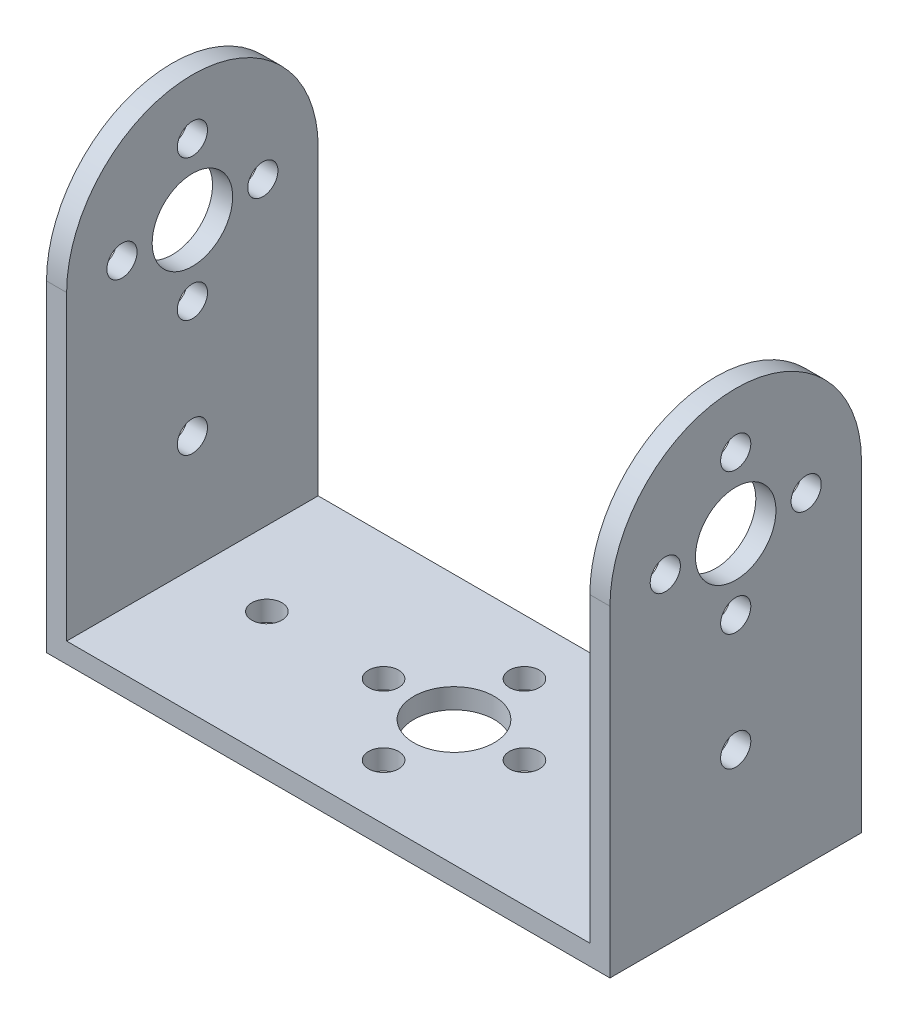
ISO-10303-21;
HEADER;
FILE_DESCRIPTION(('STEP AP214'),'2;1');
FILE_NAME('part.step','',(''),(''),'','','');
FILE_SCHEMA(('AUTOMOTIVE_DESIGN { 1 0 10303 214 1 1 1 1 }'));
ENDSEC;
DATA;
#1=APPLICATION_CONTEXT('core data for automotive mechanical design processes');
#2=APPLICATION_PROTOCOL_DEFINITION('international standard','automotive_design',2000,#1);
#3=PRODUCT_CONTEXT('',#1,'mechanical');
#4=PRODUCT('Part','Part','',(#3));
#5=PRODUCT_RELATED_PRODUCT_CATEGORY('part','',(#4));
#6=PRODUCT_DEFINITION_FORMATION('','',#4);
#7=PRODUCT_DEFINITION_CONTEXT('part definition',#1,'design');
#8=PRODUCT_DEFINITION('design','',#6,#7);
#9=PRODUCT_DEFINITION_SHAPE('','',#8);
#10=(LENGTH_UNIT() NAMED_UNIT(*) SI_UNIT(.MILLI.,.METRE.));
#11=(NAMED_UNIT(*) PLANE_ANGLE_UNIT() SI_UNIT($,.RADIAN.));
#12=(NAMED_UNIT(*) SI_UNIT($,.STERADIAN.) SOLID_ANGLE_UNIT());
#13=UNCERTAINTY_MEASURE_WITH_UNIT(LENGTH_MEASURE(1.E-05),#10,'distance_accuracy_value','');
#14=(GEOMETRIC_REPRESENTATION_CONTEXT(3) GLOBAL_UNCERTAINTY_ASSIGNED_CONTEXT((#13)) GLOBAL_UNIT_ASSIGNED_CONTEXT((#10,
#11,#12)) REPRESENTATION_CONTEXT('',''));
#15=CARTESIAN_POINT('',(0.,0.,0.));
#16=DIRECTION('',(0.,0.,1.));
#17=DIRECTION('',(1.,0.,0.));
#18=AXIS2_PLACEMENT_3D('',#15,#16,#17);
#19=CARTESIAN_POINT('',(0.,2.,0.));
#20=DIRECTION('',(0.,1.,0.));
#21=DIRECTION('',(0.,0.,1.));
#22=AXIS2_PLACEMENT_3D('',#19,#20,#21);
#23=PLANE('',#22);
#24=CARTESIAN_POINT('',(26.2542553191489,2.,-0.73138297872341));
#25=DIRECTION('',(0.,1.,0.));
#26=DIRECTION('',(0.,0.,1.));
#27=AXIS2_PLACEMENT_3D('',#24,#25,#26);
#28=CIRCLE('',#27,1.5);
#29=CARTESIAN_POINT('',(26.2542553191489,2.,0.768617021276591));
#30=VERTEX_POINT('',#29);
#31=EDGE_CURVE('E190',#30,#30,#28,.T.);
#32=ORIENTED_EDGE('',*,*,#31,.F.);
#33=EDGE_LOOP('',(#32));
#34=FACE_BOUND('',#33,.T.);
#35=CARTESIAN_POINT('',(0.654255319149036,2.,-0.731382978723379));
#36=DIRECTION('',(0.,1.,0.));
#37=DIRECTION('',(0.,0.,1.));
#38=AXIS2_PLACEMENT_3D('',#35,#36,#37);
#39=CIRCLE('',#38,1.5);
#40=CARTESIAN_POINT('',(0.654255319149036,2.,0.768617021276619));
#41=VERTEX_POINT('',#40);
#42=EDGE_CURVE('E203',#41,#41,#39,.T.);
#43=ORIENTED_EDGE('',*,*,#42,.F.);
#44=EDGE_LOOP('',(#43));
#45=FACE_BOUND('',#44,.T.);
#46=CARTESIAN_POINT('',(7.65425531914909,2.,6.2686170212766));
#47=DIRECTION('',(0.,1.,0.));
#48=DIRECTION('',(0.,0.,1.));
#49=AXIS2_PLACEMENT_3D('',#46,#47,#48);
#50=CIRCLE('',#49,1.5);
#51=CARTESIAN_POINT('',(7.65425531914909,2.,7.7686170212766));
#52=VERTEX_POINT('',#51);
#53=EDGE_CURVE('E197',#52,#52,#50,.T.);
#54=ORIENTED_EDGE('',*,*,#53,.F.);
#55=EDGE_LOOP('',(#54));
#56=FACE_BOUND('',#55,.T.);
#57=CARTESIAN_POINT('',(14.654255319149,2.,-0.731382978723479));
#58=DIRECTION('',(0.,1.,0.));
#59=DIRECTION('',(0.,0.,1.));
#60=AXIS2_PLACEMENT_3D('',#57,#58,#59);
#61=CIRCLE('',#60,1.5);
#62=CARTESIAN_POINT('',(14.654255319149,2.,0.768617021276519));
#63=VERTEX_POINT('',#62);
#64=EDGE_CURVE('E196',#63,#63,#61,.T.);
#65=ORIENTED_EDGE('',*,*,#64,.F.);
#66=EDGE_LOOP('',(#65));
#67=FACE_BOUND('',#66,.T.);
#68=CARTESIAN_POINT('',(-10.9457446808511,2.,-0.731382978723405));
#69=DIRECTION('',(0.,1.,0.));
#70=DIRECTION('',(0.,0.,1.));
#71=AXIS2_PLACEMENT_3D('',#68,#69,#70);
#72=CIRCLE('',#71,1.5);
#73=CARTESIAN_POINT('',(-10.9457446808511,2.,0.768617021276595));
#74=VERTEX_POINT('',#73);
#75=EDGE_CURVE('E221',#74,#74,#72,.T.);
#76=ORIENTED_EDGE('',*,*,#75,.F.);
#77=EDGE_LOOP('',(#76));
#78=FACE_BOUND('',#77,.T.);
#79=CARTESIAN_POINT('',(7.65425531914894,2.,-7.73138297872341));
#80=DIRECTION('',(0.,1.,0.));
#81=DIRECTION('',(0.,0.,1.));
#82=AXIS2_PLACEMENT_3D('',#79,#80,#81);
#83=CIRCLE('',#82,1.5);
#84=CARTESIAN_POINT('',(7.65425531914894,2.,-6.23138297872341));
#85=VERTEX_POINT('',#84);
#86=EDGE_CURVE('E215',#85,#85,#83,.T.);
#87=ORIENTED_EDGE('',*,*,#86,.F.);
#88=EDGE_LOOP('',(#87));
#89=FACE_BOUND('',#88,.T.);
#90=CARTESIAN_POINT('',(7.65425531914894,2.,-0.731382978723405));
#91=DIRECTION('',(0.,1.,0.));
#92=DIRECTION('',(0.,0.,1.));
#93=AXIS2_PLACEMENT_3D('',#90,#91,#92);
#94=CIRCLE('',#93,4.);
#95=CARTESIAN_POINT('',(7.65425531914894,2.,3.2686170212766));
#96=VERTEX_POINT('',#95);
#97=EDGE_CURVE('E214',#96,#96,#94,.T.);
#98=ORIENTED_EDGE('',*,*,#97,.F.);
#99=EDGE_LOOP('',(#98));
#100=FACE_BOUND('',#99,.T.);
#101=DIRECTION('',(1.,0.,0.));
#102=VECTOR('',#101,1.);
#103=CARTESIAN_POINT('',(-20.3457446808511,2.,11.7686170212766));
#104=LINE('',#103,#102);
#105=CARTESIAN_POINT('',(-18.3457446808511,2.,11.7686170212766));
#106=VERTEX_POINT('',#105);
#107=CARTESIAN_POINT('',(33.6542553191489,2.,11.7686170212766));
#108=VERTEX_POINT('',#107);
#109=EDGE_CURVE('E51',#106,#108,#104,.T.);
#110=ORIENTED_EDGE('',*,*,#109,.T.);
#111=DIRECTION('',(0.,0.,1.));
#112=VECTOR('',#111,1.);
#113=CARTESIAN_POINT('',(33.6542553191489,2.,-13.2313829787234));
#114=LINE('',#113,#112);
#115=CARTESIAN_POINT('',(33.6542553191489,2.,-13.2313829787234));
#116=VERTEX_POINT('',#115);
#117=EDGE_CURVE('E124',#116,#108,#114,.T.);
#118=ORIENTED_EDGE('',*,*,#117,.F.);
#119=DIRECTION('',(-1.,0.,0.));
#120=VECTOR('',#119,1.);
#121=CARTESIAN_POINT('',(-20.3457446808511,2.,-13.2313829787234));
#122=LINE('',#121,#120);
#123=CARTESIAN_POINT('',(-18.3457446808511,2.,-13.2313829787234));
#124=VERTEX_POINT('',#123);
#125=EDGE_CURVE('E128',#116,#124,#122,.T.);
#126=ORIENTED_EDGE('',*,*,#125,.T.);
#127=DIRECTION('',(0.,0.,1.));
#128=VECTOR('',#127,1.);
#129=CARTESIAN_POINT('',(-18.3457446808511,2.,-13.2313829787234));
#130=LINE('',#129,#128);
#131=EDGE_CURVE('E178',#124,#106,#130,.T.);
#132=ORIENTED_EDGE('',*,*,#131,.T.);
#133=EDGE_LOOP('',(#110,#118,#126,#132));
#134=FACE_BOUND('',#133,.T.);
#135=ADVANCED_FACE('F36',(#34,#45,#56,#67,#78,#89,#100,#134),#23,.T.);
#136=CARTESIAN_POINT('',(-20.3457446808511,2.,-13.2313829787234));
#137=DIRECTION('',(1.,0.,0.));
#138=DIRECTION('',(0.,0.,-1.));
#139=AXIS2_PLACEMENT_3D('',#136,#137,#138);
#140=PLANE('',#139);
#141=CARTESIAN_POINT('',(-20.3457446808511,32.,-7.73138297872331));
#142=DIRECTION('',(-1.,0.,0.));
#143=DIRECTION('',(0.,0.,1.));
#144=AXIS2_PLACEMENT_3D('',#141,#142,#143);
#145=CIRCLE('',#144,1.5);
#146=CARTESIAN_POINT('',(-20.3457446808511,32.,-6.23138297872331));
#147=VERTEX_POINT('',#146);
#148=EDGE_CURVE('E138',#147,#147,#145,.T.);
#149=ORIENTED_EDGE('',*,*,#148,.F.);
#150=EDGE_LOOP('',(#149));
#151=FACE_BOUND('',#150,.T.);
#152=CARTESIAN_POINT('',(-20.3457446808511,25.,-0.731382978723258));
#153=DIRECTION('',(-1.,0.,0.));
#154=DIRECTION('',(0.,0.,1.));
#155=AXIS2_PLACEMENT_3D('',#152,#153,#154);
#156=CIRCLE('',#155,1.5);
#157=CARTESIAN_POINT('',(-20.3457446808511,25.,0.768617021276742));
#158=VERTEX_POINT('',#157);
#159=EDGE_CURVE('E148',#158,#158,#156,.T.);
#160=ORIENTED_EDGE('',*,*,#159,.F.);
#161=EDGE_LOOP('',(#160));
#162=FACE_BOUND('',#161,.T.);
#163=CARTESIAN_POINT('',(-20.3457446808511,32.0000000000001,6.26861702127669));
#164=DIRECTION('',(-1.,0.,0.));
#165=DIRECTION('',(0.,0.,1.));
#166=AXIS2_PLACEMENT_3D('',#163,#164,#165);
#167=CIRCLE('',#166,1.5);
#168=CARTESIAN_POINT('',(-20.3457446808511,32.0000000000001,7.76861702127669));
#169=VERTEX_POINT('',#168);
#170=EDGE_CURVE('E140',#169,#169,#167,.T.);
#171=ORIENTED_EDGE('',*,*,#170,.F.);
#172=EDGE_LOOP('',(#171));
#173=FACE_BOUND('',#172,.T.);
#174=CARTESIAN_POINT('',(-20.3457446808511,39.,-0.731382978723405));
#175=DIRECTION('',(-1.,0.,0.));
#176=DIRECTION('',(0.,0.,1.));
#177=AXIS2_PLACEMENT_3D('',#174,#175,#176);
#178=CIRCLE('',#177,1.5);
#179=CARTESIAN_POINT('',(-20.3457446808511,39.,0.768617021276596));
#180=VERTEX_POINT('',#179);
#181=EDGE_CURVE('E147',#180,#180,#178,.T.);
#182=ORIENTED_EDGE('',*,*,#181,.F.);
#183=EDGE_LOOP('',(#182));
#184=FACE_BOUND('',#183,.T.);
#185=CARTESIAN_POINT('',(-20.3457446808511,32.,-0.731382978723405));
#186=DIRECTION('',(-1.,0.,0.));
#187=DIRECTION('',(0.,0.,1.));
#188=AXIS2_PLACEMENT_3D('',#185,#186,#187);
#189=CIRCLE('',#188,4.);
#190=CARTESIAN_POINT('',(-20.3457446808511,32.,3.2686170212766));
#191=VERTEX_POINT('',#190);
#192=EDGE_CURVE('E158',#191,#191,#189,.T.);
#193=ORIENTED_EDGE('',*,*,#192,.F.);
#194=EDGE_LOOP('',(#193));
#195=FACE_BOUND('',#194,.T.);
#196=CARTESIAN_POINT('',(-20.3457446808511,13.4,-0.731382978723405));
#197=DIRECTION('',(-1.,0.,0.));
#198=DIRECTION('',(0.,0.,1.));
#199=AXIS2_PLACEMENT_3D('',#196,#197,#198);
#200=CIRCLE('',#199,1.5);
#201=CARTESIAN_POINT('',(-20.3457446808511,13.4,0.768617021276595));
#202=VERTEX_POINT('',#201);
#203=EDGE_CURVE('E165',#202,#202,#200,.T.);
#204=ORIENTED_EDGE('',*,*,#203,.F.);
#205=EDGE_LOOP('',(#204));
#206=FACE_BOUND('',#205,.T.);
#207=DIRECTION('',(0.,0.,1.));
#208=VECTOR('',#207,1.);
#209=CARTESIAN_POINT('',(-20.3457446808511,0.,-13.2313829787234));
#210=LINE('',#209,#208);
#211=CARTESIAN_POINT('',(-20.3457446808511,0.,-13.2313829787234));
#212=VERTEX_POINT('',#211);
#213=CARTESIAN_POINT('',(-20.3457446808511,0.,11.7686170212766));
#214=VERTEX_POINT('',#213);
#215=EDGE_CURVE('E232',#212,#214,#210,.T.);
#216=ORIENTED_EDGE('',*,*,#215,.T.);
#217=DIRECTION('',(0.,-1.,0.));
#218=VECTOR('',#217,1.);
#219=CARTESIAN_POINT('',(-20.3457446808511,2.,11.7686170212766));
#220=LINE('',#219,#218);
#221=CARTESIAN_POINT('',(-20.3457446808511,32.,11.7686170212766));
#222=VERTEX_POINT('',#221);
#223=EDGE_CURVE('E11',#222,#214,#220,.T.);
#224=ORIENTED_EDGE('',*,*,#223,.F.);
#225=CARTESIAN_POINT('',(-20.3457446808511,32.,-0.731382978723405));
#226=DIRECTION('',(-1.,0.,0.));
#227=DIRECTION('',(0.,0.,1.));
#228=AXIS2_PLACEMENT_3D('',#225,#226,#227);
#229=CIRCLE('',#228,12.5);
#230=CARTESIAN_POINT('',(-20.3457446808511,32.,-13.2313829787234));
#231=VERTEX_POINT('',#230);
#232=EDGE_CURVE('E175',#222,#231,#229,.T.);
#233=ORIENTED_EDGE('',*,*,#232,.T.);
#234=DIRECTION('',(0.,-1.,0.));
#235=VECTOR('',#234,1.);
#236=CARTESIAN_POINT('',(-20.3457446808511,2.,-13.2313829787234));
#237=LINE('',#236,#235);
#238=EDGE_CURVE('E238',#231,#212,#237,.T.);
#239=ORIENTED_EDGE('',*,*,#238,.T.);
#240=EDGE_LOOP('',(#216,#224,#233,#239));
#241=FACE_BOUND('',#240,.T.);
#242=ADVANCED_FACE('F38',(#151,#162,#173,#184,#195,#206,#241),#140,.F.);
#243=CARTESIAN_POINT('',(-20.3457446808511,2.,11.7686170212766));
#244=DIRECTION('',(0.,0.,-1.));
#245=DIRECTION('',(-1.,0.,0.));
#246=AXIS2_PLACEMENT_3D('',#243,#244,#245);
#247=PLANE('',#246);
#248=DIRECTION('',(1.,0.,0.));
#249=VECTOR('',#248,1.);
#250=CARTESIAN_POINT('',(-20.3457446808511,0.,11.7686170212766));
#251=LINE('',#250,#249);
#252=CARTESIAN_POINT('',(35.6542553191489,0.,11.7686170212766));
#253=VERTEX_POINT('',#252);
#254=EDGE_CURVE('E241',#214,#253,#251,.T.);
#255=ORIENTED_EDGE('',*,*,#254,.T.);
#256=DIRECTION('',(0.,-1.,0.));
#257=VECTOR('',#256,1.);
#258=CARTESIAN_POINT('',(35.6542553191489,2.,11.7686170212766));
#259=LINE('',#258,#257);
#260=CARTESIAN_POINT('',(35.6542553191489,32.,11.7686170212766));
#261=VERTEX_POINT('',#260);
#262=EDGE_CURVE('E44',#261,#253,#259,.T.);
#263=ORIENTED_EDGE('',*,*,#262,.F.);
#264=DIRECTION('',(1.,0.,0.));
#265=VECTOR('',#264,1.);
#266=CARTESIAN_POINT('',(33.6542553191489,32.,11.7686170212766));
#267=LINE('',#266,#265);
#268=CARTESIAN_POINT('',(33.6542553191489,32.,11.7686170212766));
#269=VERTEX_POINT('',#268);
#270=EDGE_CURVE('E123',#269,#261,#267,.T.);
#271=ORIENTED_EDGE('',*,*,#270,.F.);
#272=DIRECTION('',(0.,1.,0.));
#273=VECTOR('',#272,1.);
#274=CARTESIAN_POINT('',(33.6542553191489,2.,11.7686170212766));
#275=LINE('',#274,#273);
#276=EDGE_CURVE('E110',#108,#269,#275,.T.);
#277=ORIENTED_EDGE('',*,*,#276,.F.);
#278=ORIENTED_EDGE('',*,*,#109,.F.);
#279=DIRECTION('',(0.,1.,0.));
#280=VECTOR('',#279,1.);
#281=CARTESIAN_POINT('',(-18.3457446808511,2.,11.7686170212766));
#282=LINE('',#281,#280);
#283=CARTESIAN_POINT('',(-18.3457446808511,32.,11.7686170212766));
#284=VERTEX_POINT('',#283);
#285=EDGE_CURVE('E59',#106,#284,#282,.T.);
#286=ORIENTED_EDGE('',*,*,#285,.T.);
#287=DIRECTION('',(-1.,0.,0.));
#288=VECTOR('',#287,1.);
#289=CARTESIAN_POINT('',(-18.3457446808511,32.,11.7686170212766));
#290=LINE('',#289,#288);
#291=EDGE_CURVE('E184',#284,#222,#290,.T.);
#292=ORIENTED_EDGE('',*,*,#291,.T.);
#293=ORIENTED_EDGE('',*,*,#223,.T.);
#294=EDGE_LOOP('',(#255,#263,#271,#277,#278,#286,#292,#293));
#295=FACE_BOUND('',#294,.T.);
#296=ADVANCED_FACE('F264',(#295),#247,.F.);
#297=CARTESIAN_POINT('',(35.6542553191489,2.,-13.2313829787234));
#298=DIRECTION('',(-1.,0.,0.));
#299=DIRECTION('',(0.,0.,1.));
#300=AXIS2_PLACEMENT_3D('',#297,#298,#299);
#301=PLANE('',#300);
#302=CARTESIAN_POINT('',(35.6542553191489,32.,-7.73138297872331));
#303=DIRECTION('',(-1.,0.,0.));
#304=DIRECTION('',(0.,0.,1.));
#305=AXIS2_PLACEMENT_3D('',#302,#303,#304);
#306=CIRCLE('',#305,1.5);
#307=CARTESIAN_POINT('',(35.6542553191489,32.,-6.23138297872331));
#308=VERTEX_POINT('',#307);
#309=EDGE_CURVE('E562',#308,#308,#306,.T.);
#310=ORIENTED_EDGE('',*,*,#309,.T.);
#311=EDGE_LOOP('',(#310));
#312=FACE_BOUND('',#311,.T.);
#313=CARTESIAN_POINT('',(35.6542553191489,25.,-0.731382978723258));
#314=DIRECTION('',(-1.,0.,0.));
#315=DIRECTION('',(0.,0.,1.));
#316=AXIS2_PLACEMENT_3D('',#313,#314,#315);
#317=CIRCLE('',#316,1.5);
#318=CARTESIAN_POINT('',(35.6542553191489,25.,0.768617021276742));
#319=VERTEX_POINT('',#318);
#320=EDGE_CURVE('E598',#319,#319,#317,.T.);
#321=ORIENTED_EDGE('',*,*,#320,.T.);
#322=EDGE_LOOP('',(#321));
#323=FACE_BOUND('',#322,.T.);
#324=CARTESIAN_POINT('',(35.6542553191489,32.0000000000001,6.26861702127669));
#325=DIRECTION('',(-1.,0.,0.));
#326=DIRECTION('',(0.,0.,1.));
#327=AXIS2_PLACEMENT_3D('',#324,#325,#326);
#328=CIRCLE('',#327,1.5);
#329=CARTESIAN_POINT('',(35.6542553191489,32.0000000000001,7.76861702127669));
#330=VERTEX_POINT('',#329);
#331=EDGE_CURVE('E582',#330,#330,#328,.T.);
#332=ORIENTED_EDGE('',*,*,#331,.T.);
#333=EDGE_LOOP('',(#332));
#334=FACE_BOUND('',#333,.T.);
#335=CARTESIAN_POINT('',(35.6542553191489,39.,-0.731382978723405));
#336=DIRECTION('',(-1.,0.,0.));
#337=DIRECTION('',(0.,0.,1.));
#338=AXIS2_PLACEMENT_3D('',#335,#336,#337);
#339=CIRCLE('',#338,1.5);
#340=CARTESIAN_POINT('',(35.6542553191489,39.,0.768617021276596));
#341=VERTEX_POINT('',#340);
#342=EDGE_CURVE('E577',#341,#341,#339,.T.);
#343=ORIENTED_EDGE('',*,*,#342,.T.);
#344=EDGE_LOOP('',(#343));
#345=FACE_BOUND('',#344,.T.);
#346=CARTESIAN_POINT('',(35.6542553191489,32.,-0.731382978723405));
#347=DIRECTION('',(-1.,0.,0.));
#348=DIRECTION('',(0.,0.,1.));
#349=AXIS2_PLACEMENT_3D('',#346,#347,#348);
#350=CIRCLE('',#349,4.);
#351=CARTESIAN_POINT('',(35.6542553191489,32.,3.2686170212766));
#352=VERTEX_POINT('',#351);
#353=EDGE_CURVE('E571',#352,#352,#350,.T.);
#354=ORIENTED_EDGE('',*,*,#353,.T.);
#355=EDGE_LOOP('',(#354));
#356=FACE_BOUND('',#355,.T.);
#357=CARTESIAN_POINT('',(35.6542553191489,13.4,-0.731382978723405));
#358=DIRECTION('',(-1.,0.,0.));
#359=DIRECTION('',(0.,0.,1.));
#360=AXIS2_PLACEMENT_3D('',#357,#358,#359);
#361=CIRCLE('',#360,1.5);
#362=CARTESIAN_POINT('',(35.6542553191489,13.4,0.768617021276595));
#363=VERTEX_POINT('',#362);
#364=EDGE_CURVE('E130',#363,#363,#361,.T.);
#365=ORIENTED_EDGE('',*,*,#364,.T.);
#366=EDGE_LOOP('',(#365));
#367=FACE_BOUND('',#366,.T.);
#368=DIRECTION('',(0.,0.,-1.));
#369=VECTOR('',#368,1.);
#370=CARTESIAN_POINT('',(35.6542553191489,0.,-13.2313829787234));
#371=LINE('',#370,#369);
#372=CARTESIAN_POINT('',(35.6542553191489,0.,-13.2313829787234));
#373=VERTEX_POINT('',#372);
#374=EDGE_CURVE('E243',#253,#373,#371,.T.);
#375=ORIENTED_EDGE('',*,*,#374,.T.);
#376=DIRECTION('',(0.,-1.,0.));
#377=VECTOR('',#376,1.);
#378=CARTESIAN_POINT('',(35.6542553191489,2.,-13.2313829787234));
#379=LINE('',#378,#377);
#380=CARTESIAN_POINT('',(35.6542553191489,32.,-13.2313829787234));
#381=VERTEX_POINT('',#380);
#382=EDGE_CURVE('E248',#381,#373,#379,.T.);
#383=ORIENTED_EDGE('',*,*,#382,.F.);
#384=CARTESIAN_POINT('',(35.6542553191489,32.,-0.731382978723405));
#385=DIRECTION('',(-1.,0.,0.));
#386=DIRECTION('',(0.,0.,1.));
#387=AXIS2_PLACEMENT_3D('',#384,#385,#386);
#388=CIRCLE('',#387,12.5);
#389=EDGE_CURVE('E120',#261,#381,#388,.T.);
#390=ORIENTED_EDGE('',*,*,#389,.F.);
#391=ORIENTED_EDGE('',*,*,#262,.T.);
#392=EDGE_LOOP('',(#375,#383,#390,#391));
#393=FACE_BOUND('',#392,.T.);
#394=ADVANCED_FACE('F252',(#312,#323,#334,#345,#356,#367,#393),#301,.F.);
#395=CARTESIAN_POINT('',(-20.3457446808511,2.,-13.2313829787234));
#396=DIRECTION('',(0.,0.,1.));
#397=DIRECTION('',(1.,0.,0.));
#398=AXIS2_PLACEMENT_3D('',#395,#396,#397);
#399=PLANE('',#398);
#400=DIRECTION('',(-1.,0.,0.));
#401=VECTOR('',#400,1.);
#402=CARTESIAN_POINT('',(-20.3457446808511,0.,-13.2313829787234));
#403=LINE('',#402,#401);
#404=EDGE_CURVE('E236',#373,#212,#403,.T.);
#405=ORIENTED_EDGE('',*,*,#404,.T.);
#406=ORIENTED_EDGE('',*,*,#238,.F.);
#407=DIRECTION('',(-1.,0.,0.));
#408=VECTOR('',#407,1.);
#409=CARTESIAN_POINT('',(-18.3457446808511,32.,-13.2313829787234));
#410=LINE('',#409,#408);
#411=CARTESIAN_POINT('',(-18.3457446808511,32.,-13.2313829787234));
#412=VERTEX_POINT('',#411);
#413=EDGE_CURVE('E187',#412,#231,#410,.T.);
#414=ORIENTED_EDGE('',*,*,#413,.F.);
#415=DIRECTION('',(0.,-1.,0.));
#416=VECTOR('',#415,1.);
#417=CARTESIAN_POINT('',(-18.3457446808511,2.,-13.2313829787234));
#418=LINE('',#417,#416);
#419=EDGE_CURVE('E176',#412,#124,#418,.T.);
#420=ORIENTED_EDGE('',*,*,#419,.T.);
#421=ORIENTED_EDGE('',*,*,#125,.F.);
#422=DIRECTION('',(0.,-1.,0.));
#423=VECTOR('',#422,1.);
#424=CARTESIAN_POINT('',(33.6542553191489,2.,-13.2313829787234));
#425=LINE('',#424,#423);
#426=CARTESIAN_POINT('',(33.6542553191489,32.,-13.2313829787234));
#427=VERTEX_POINT('',#426);
#428=EDGE_CURVE('E108',#427,#116,#425,.T.);
#429=ORIENTED_EDGE('',*,*,#428,.F.);
#430=DIRECTION('',(1.,0.,0.));
#431=VECTOR('',#430,1.);
#432=CARTESIAN_POINT('',(33.6542553191489,32.,-13.2313829787234));
#433=LINE('',#432,#431);
#434=EDGE_CURVE('E117',#427,#381,#433,.T.);
#435=ORIENTED_EDGE('',*,*,#434,.T.);
#436=ORIENTED_EDGE('',*,*,#382,.T.);
#437=EDGE_LOOP('',(#405,#406,#414,#420,#421,#429,#435,#436));
#438=FACE_BOUND('',#437,.T.);
#439=ADVANCED_FACE('F126',(#438),#399,.F.);
#440=CARTESIAN_POINT('',(0.,0.,0.));
#441=DIRECTION('',(0.,1.,0.));
#442=DIRECTION('',(0.,0.,1.));
#443=AXIS2_PLACEMENT_3D('',#440,#441,#442);
#444=PLANE('',#443);
#445=CARTESIAN_POINT('',(26.2542553191489,0.,-0.73138297872341));
#446=DIRECTION('',(0.,1.,0.));
#447=DIRECTION('',(0.,0.,1.));
#448=AXIS2_PLACEMENT_3D('',#445,#446,#447);
#449=CIRCLE('',#448,1.5);
#450=CARTESIAN_POINT('',(26.2542553191489,0.,0.768617021276591));
#451=VERTEX_POINT('',#450);
#452=EDGE_CURVE('E206',#451,#451,#449,.T.);
#453=ORIENTED_EDGE('',*,*,#452,.T.);
#454=EDGE_LOOP('',(#453));
#455=FACE_BOUND('',#454,.T.);
#456=CARTESIAN_POINT('',(0.654255319149036,0.,-0.731382978723379));
#457=DIRECTION('',(0.,1.,0.));
#458=DIRECTION('',(0.,0.,1.));
#459=AXIS2_PLACEMENT_3D('',#456,#457,#458);
#460=CIRCLE('',#459,1.5);
#461=CARTESIAN_POINT('',(0.654255319149036,0.,0.768617021276619));
#462=VERTEX_POINT('',#461);
#463=EDGE_CURVE('E200',#462,#462,#460,.T.);
#464=ORIENTED_EDGE('',*,*,#463,.T.);
#465=EDGE_LOOP('',(#464));
#466=FACE_BOUND('',#465,.T.);
#467=CARTESIAN_POINT('',(7.65425531914909,0.,6.2686170212766));
#468=DIRECTION('',(0.,1.,0.));
#469=DIRECTION('',(0.,0.,1.));
#470=AXIS2_PLACEMENT_3D('',#467,#468,#469);
#471=CIRCLE('',#470,1.5);
#472=CARTESIAN_POINT('',(7.65425531914909,0.,7.7686170212766));
#473=VERTEX_POINT('',#472);
#474=EDGE_CURVE('E193',#473,#473,#471,.T.);
#475=ORIENTED_EDGE('',*,*,#474,.T.);
#476=EDGE_LOOP('',(#475));
#477=FACE_BOUND('',#476,.T.);
#478=CARTESIAN_POINT('',(14.654255319149,0.,-0.731382978723479));
#479=DIRECTION('',(0.,1.,0.));
#480=DIRECTION('',(0.,0.,1.));
#481=AXIS2_PLACEMENT_3D('',#478,#479,#480);
#482=CIRCLE('',#481,1.5);
#483=CARTESIAN_POINT('',(14.654255319149,0.,0.768617021276519));
#484=VERTEX_POINT('',#483);
#485=EDGE_CURVE('E224',#484,#484,#482,.T.);
#486=ORIENTED_EDGE('',*,*,#485,.T.);
#487=EDGE_LOOP('',(#486));
#488=FACE_BOUND('',#487,.T.);
#489=CARTESIAN_POINT('',(-10.9457446808511,0.,-0.731382978723405));
#490=DIRECTION('',(0.,1.,0.));
#491=DIRECTION('',(0.,0.,1.));
#492=AXIS2_PLACEMENT_3D('',#489,#490,#491);
#493=CIRCLE('',#492,1.5);
#494=CARTESIAN_POINT('',(-10.9457446808511,0.,0.768617021276595));
#495=VERTEX_POINT('',#494);
#496=EDGE_CURVE('E218',#495,#495,#493,.T.);
#497=ORIENTED_EDGE('',*,*,#496,.T.);
#498=EDGE_LOOP('',(#497));
#499=FACE_BOUND('',#498,.T.);
#500=CARTESIAN_POINT('',(7.65425531914894,0.,-7.73138297872341));
#501=DIRECTION('',(0.,1.,0.));
#502=DIRECTION('',(0.,0.,1.));
#503=AXIS2_PLACEMENT_3D('',#500,#501,#502);
#504=CIRCLE('',#503,1.5);
#505=CARTESIAN_POINT('',(7.65425531914894,0.,-6.23138297872341));
#506=VERTEX_POINT('',#505);
#507=EDGE_CURVE('E211',#506,#506,#504,.T.);
#508=ORIENTED_EDGE('',*,*,#507,.T.);
#509=EDGE_LOOP('',(#508));
#510=FACE_BOUND('',#509,.T.);
#511=CARTESIAN_POINT('',(7.65425531914894,0.,-0.731382978723405));
#512=DIRECTION('',(0.,1.,0.));
#513=DIRECTION('',(0.,0.,1.));
#514=AXIS2_PLACEMENT_3D('',#511,#512,#513);
#515=CIRCLE('',#514,4.);
#516=CARTESIAN_POINT('',(7.65425531914894,0.,3.2686170212766));
#517=VERTEX_POINT('',#516);
#518=EDGE_CURVE('E229',#517,#517,#515,.T.);
#519=ORIENTED_EDGE('',*,*,#518,.T.);
#520=EDGE_LOOP('',(#519));
#521=FACE_BOUND('',#520,.T.);
#522=ORIENTED_EDGE('',*,*,#215,.F.);
#523=ORIENTED_EDGE('',*,*,#404,.F.);
#524=ORIENTED_EDGE('',*,*,#374,.F.);
#525=ORIENTED_EDGE('',*,*,#254,.F.);
#526=EDGE_LOOP('',(#522,#523,#524,#525));
#527=FACE_BOUND('',#526,.T.);
#528=ADVANCED_FACE('F257',(#455,#466,#477,#488,#499,#510,#521,#527),#444,.F.);
#529=CARTESIAN_POINT('',(7.65425531914894,0.,-0.731382978723405));
#530=DIRECTION('',(0.,1.,0.));
#531=DIRECTION('',(0.,0.,1.));
#532=AXIS2_PLACEMENT_3D('',#529,#530,#531);
#533=CYLINDRICAL_SURFACE('',#532,4.);
#534=ORIENTED_EDGE('',*,*,#518,.F.);
#535=EDGE_LOOP('',(#534));
#536=FACE_BOUND('',#535,.T.);
#537=ORIENTED_EDGE('',*,*,#97,.T.);
#538=EDGE_LOOP('',(#537));
#539=FACE_BOUND('',#538,.T.);
#540=ADVANCED_FACE('F282',(#536,#539),#533,.F.);
#541=CARTESIAN_POINT('',(7.65425531914894,0.,-7.73138297872341));
#542=DIRECTION('',(0.,1.,0.));
#543=DIRECTION('',(0.,0.,1.));
#544=AXIS2_PLACEMENT_3D('',#541,#542,#543);
#545=CYLINDRICAL_SURFACE('',#544,1.5);
#546=ORIENTED_EDGE('',*,*,#507,.F.);
#547=EDGE_LOOP('',(#546));
#548=FACE_BOUND('',#547,.T.);
#549=ORIENTED_EDGE('',*,*,#86,.T.);
#550=EDGE_LOOP('',(#549));
#551=FACE_BOUND('',#550,.T.);
#552=ADVANCED_FACE('F303',(#548,#551),#545,.F.);
#553=CARTESIAN_POINT('',(-10.9457446808511,0.,-0.731382978723405));
#554=DIRECTION('',(0.,1.,0.));
#555=DIRECTION('',(0.,0.,1.));
#556=AXIS2_PLACEMENT_3D('',#553,#554,#555);
#557=CYLINDRICAL_SURFACE('',#556,1.5);
#558=ORIENTED_EDGE('',*,*,#496,.F.);
#559=EDGE_LOOP('',(#558));
#560=FACE_BOUND('',#559,.T.);
#561=ORIENTED_EDGE('',*,*,#75,.T.);
#562=EDGE_LOOP('',(#561));
#563=FACE_BOUND('',#562,.T.);
#564=ADVANCED_FACE('F310',(#560,#563),#557,.F.);
#565=CARTESIAN_POINT('',(14.654255319149,0.,-0.731382978723479));
#566=DIRECTION('',(0.,1.,0.));
#567=DIRECTION('',(0.,0.,1.));
#568=AXIS2_PLACEMENT_3D('',#565,#566,#567);
#569=CYLINDRICAL_SURFACE('',#568,1.5);
#570=ORIENTED_EDGE('',*,*,#485,.F.);
#571=EDGE_LOOP('',(#570));
#572=FACE_BOUND('',#571,.T.);
#573=ORIENTED_EDGE('',*,*,#64,.T.);
#574=EDGE_LOOP('',(#573));
#575=FACE_BOUND('',#574,.T.);
#576=ADVANCED_FACE('F318',(#572,#575),#569,.F.);
#577=CARTESIAN_POINT('',(7.65425531914909,0.,6.2686170212766));
#578=DIRECTION('',(0.,1.,0.));
#579=DIRECTION('',(0.,0.,1.));
#580=AXIS2_PLACEMENT_3D('',#577,#578,#579);
#581=CYLINDRICAL_SURFACE('',#580,1.5);
#582=ORIENTED_EDGE('',*,*,#474,.F.);
#583=EDGE_LOOP('',(#582));
#584=FACE_BOUND('',#583,.T.);
#585=ORIENTED_EDGE('',*,*,#53,.T.);
#586=EDGE_LOOP('',(#585));
#587=FACE_BOUND('',#586,.T.);
#588=ADVANCED_FACE('F326',(#584,#587),#581,.F.);
#589=CARTESIAN_POINT('',(0.654255319149036,0.,-0.731382978723379));
#590=DIRECTION('',(0.,1.,0.));
#591=DIRECTION('',(0.,0.,1.));
#592=AXIS2_PLACEMENT_3D('',#589,#590,#591);
#593=CYLINDRICAL_SURFACE('',#592,1.5);
#594=ORIENTED_EDGE('',*,*,#463,.F.);
#595=EDGE_LOOP('',(#594));
#596=FACE_BOUND('',#595,.T.);
#597=ORIENTED_EDGE('',*,*,#42,.T.);
#598=EDGE_LOOP('',(#597));
#599=FACE_BOUND('',#598,.T.);
#600=ADVANCED_FACE('F333',(#596,#599),#593,.F.);
#601=CARTESIAN_POINT('',(26.2542553191489,0.,-0.73138297872341));
#602=DIRECTION('',(0.,1.,0.));
#603=DIRECTION('',(0.,0.,1.));
#604=AXIS2_PLACEMENT_3D('',#601,#602,#603);
#605=CYLINDRICAL_SURFACE('',#604,1.5);
#606=ORIENTED_EDGE('',*,*,#452,.F.);
#607=EDGE_LOOP('',(#606));
#608=FACE_BOUND('',#607,.T.);
#609=ORIENTED_EDGE('',*,*,#31,.T.);
#610=EDGE_LOOP('',(#609));
#611=FACE_BOUND('',#610,.T.);
#612=ADVANCED_FACE('F341',(#608,#611),#605,.F.);
#613=CARTESIAN_POINT('',(-18.3457446808511,32.,-0.731382978723405));
#614=DIRECTION('',(-1.,0.,0.));
#615=DIRECTION('',(0.,0.,1.));
#616=AXIS2_PLACEMENT_3D('',#613,#614,#615);
#617=CYLINDRICAL_SURFACE('',#616,12.5);
#618=ORIENTED_EDGE('',*,*,#232,.F.);
#619=ORIENTED_EDGE('',*,*,#291,.F.);
#620=CARTESIAN_POINT('',(-18.3457446808511,32.,-0.731382978723405));
#621=DIRECTION('',(-1.,0.,0.));
#622=DIRECTION('',(0.,0.,1.));
#623=AXIS2_PLACEMENT_3D('',#620,#621,#622);
#624=CIRCLE('',#623,12.5);
#625=EDGE_CURVE('E181',#284,#412,#624,.T.);
#626=ORIENTED_EDGE('',*,*,#625,.T.);
#627=ORIENTED_EDGE('',*,*,#413,.T.);
#628=EDGE_LOOP('',(#618,#619,#626,#627));
#629=FACE_BOUND('',#628,.T.);
#630=ADVANCED_FACE('F261',(#629),#617,.T.);
#631=CARTESIAN_POINT('',(-18.3457446808511,32.,-0.731382978723405));
#632=DIRECTION('',(-1.,0.,0.));
#633=DIRECTION('',(0.,0.,1.));
#634=AXIS2_PLACEMENT_3D('',#631,#632,#633);
#635=PLANE('',#634);
#636=CARTESIAN_POINT('',(-18.3457446808511,32.,-7.73138297872331));
#637=DIRECTION('',(-1.,0.,0.));
#638=DIRECTION('',(0.,0.,1.));
#639=AXIS2_PLACEMENT_3D('',#636,#637,#638);
#640=CIRCLE('',#639,1.5);
#641=CARTESIAN_POINT('',(-18.3457446808511,32.,-6.23138297872331));
#642=VERTEX_POINT('',#641);
#643=EDGE_CURVE('E151',#642,#642,#640,.F.);
#644=ORIENTED_EDGE('',*,*,#643,.F.);
#645=EDGE_LOOP('',(#644));
#646=FACE_BOUND('',#645,.T.);
#647=CARTESIAN_POINT('',(-18.3457446808511,25.,-0.731382978723258));
#648=DIRECTION('',(-1.,0.,0.));
#649=DIRECTION('',(0.,0.,1.));
#650=AXIS2_PLACEMENT_3D('',#647,#648,#649);
#651=CIRCLE('',#650,1.5);
#652=CARTESIAN_POINT('',(-18.3457446808511,25.,0.768617021276742));
#653=VERTEX_POINT('',#652);
#654=EDGE_CURVE('E144',#653,#653,#651,.F.);
#655=ORIENTED_EDGE('',*,*,#654,.F.);
#656=EDGE_LOOP('',(#655));
#657=FACE_BOUND('',#656,.T.);
#658=CARTESIAN_POINT('',(-18.3457446808511,32.0000000000001,6.26861702127669));
#659=DIRECTION('',(-1.,0.,0.));
#660=DIRECTION('',(0.,0.,1.));
#661=AXIS2_PLACEMENT_3D('',#658,#659,#660);
#662=CIRCLE('',#661,1.5);
#663=CARTESIAN_POINT('',(-18.3457446808511,32.0000000000001,7.76861702127669));
#664=VERTEX_POINT('',#663);
#665=EDGE_CURVE('E143',#664,#664,#662,.F.);
#666=ORIENTED_EDGE('',*,*,#665,.F.);
#667=EDGE_LOOP('',(#666));
#668=FACE_BOUND('',#667,.T.);
#669=CARTESIAN_POINT('',(-18.3457446808511,39.,-0.731382978723405));
#670=DIRECTION('',(-1.,0.,0.));
#671=DIRECTION('',(0.,0.,1.));
#672=AXIS2_PLACEMENT_3D('',#669,#670,#671);
#673=CIRCLE('',#672,1.5);
#674=CARTESIAN_POINT('',(-18.3457446808511,39.,0.768617021276596));
#675=VERTEX_POINT('',#674);
#676=EDGE_CURVE('E162',#675,#675,#673,.F.);
#677=ORIENTED_EDGE('',*,*,#676,.F.);
#678=EDGE_LOOP('',(#677));
#679=FACE_BOUND('',#678,.T.);
#680=CARTESIAN_POINT('',(-18.3457446808511,32.,-0.731382978723405));
#681=DIRECTION('',(-1.,0.,0.));
#682=DIRECTION('',(0.,0.,1.));
#683=AXIS2_PLACEMENT_3D('',#680,#681,#682);
#684=CIRCLE('',#683,4.);
#685=CARTESIAN_POINT('',(-18.3457446808511,32.,3.2686170212766));
#686=VERTEX_POINT('',#685);
#687=EDGE_CURVE('E161',#686,#686,#684,.F.);
#688=ORIENTED_EDGE('',*,*,#687,.F.);
#689=EDGE_LOOP('',(#688));
#690=FACE_BOUND('',#689,.T.);
#691=CARTESIAN_POINT('',(-18.3457446808511,13.4,-0.731382978723405));
#692=DIRECTION('',(-1.,0.,0.));
#693=DIRECTION('',(0.,0.,1.));
#694=AXIS2_PLACEMENT_3D('',#691,#692,#693);
#695=CIRCLE('',#694,1.5);
#696=CARTESIAN_POINT('',(-18.3457446808511,13.4,0.768617021276595));
#697=VERTEX_POINT('',#696);
#698=EDGE_CURVE('E172',#697,#697,#695,.F.);
#699=ORIENTED_EDGE('',*,*,#698,.F.);
#700=EDGE_LOOP('',(#699));
#701=FACE_BOUND('',#700,.T.);
#702=ORIENTED_EDGE('',*,*,#419,.F.);
#703=ORIENTED_EDGE('',*,*,#625,.F.);
#704=ORIENTED_EDGE('',*,*,#285,.F.);
#705=ORIENTED_EDGE('',*,*,#131,.F.);
#706=EDGE_LOOP('',(#702,#703,#704,#705));
#707=FACE_BOUND('',#706,.T.);
#708=ADVANCED_FACE('F263',(#646,#657,#668,#679,#690,#701,#707),#635,.F.);
#709=CARTESIAN_POINT('',(35.6552553191489,13.4,-0.731382978723405));
#710=DIRECTION('',(-1.,0.,0.));
#711=DIRECTION('',(0.,0.,1.));
#712=AXIS2_PLACEMENT_3D('',#709,#710,#711);
#713=CYLINDRICAL_SURFACE('',#712,1.5);
#714=ORIENTED_EDGE('',*,*,#203,.T.);
#715=EDGE_LOOP('',(#714));
#716=FACE_BOUND('',#715,.T.);
#717=ORIENTED_EDGE('',*,*,#698,.T.);
#718=EDGE_LOOP('',(#717));
#719=FACE_BOUND('',#718,.T.);
#720=ADVANCED_FACE('F363',(#716,#719),#713,.F.);
#721=CARTESIAN_POINT('',(35.6552553191489,32.,-0.731382978723405));
#722=DIRECTION('',(-1.,0.,0.));
#723=DIRECTION('',(0.,0.,1.));
#724=AXIS2_PLACEMENT_3D('',#721,#722,#723);
#725=CYLINDRICAL_SURFACE('',#724,4.);
#726=ORIENTED_EDGE('',*,*,#192,.T.);
#727=EDGE_LOOP('',(#726));
#728=FACE_BOUND('',#727,.T.);
#729=ORIENTED_EDGE('',*,*,#687,.T.);
#730=EDGE_LOOP('',(#729));
#731=FACE_BOUND('',#730,.T.);
#732=ADVANCED_FACE('F371',(#728,#731),#725,.F.);
#733=CARTESIAN_POINT('',(35.6552553191489,39.,-0.731382978723405));
#734=DIRECTION('',(-1.,0.,0.));
#735=DIRECTION('',(0.,0.,1.));
#736=AXIS2_PLACEMENT_3D('',#733,#734,#735);
#737=CYLINDRICAL_SURFACE('',#736,1.5);
#738=ORIENTED_EDGE('',*,*,#181,.T.);
#739=EDGE_LOOP('',(#738));
#740=FACE_BOUND('',#739,.T.);
#741=ORIENTED_EDGE('',*,*,#676,.T.);
#742=EDGE_LOOP('',(#741));
#743=FACE_BOUND('',#742,.T.);
#744=ADVANCED_FACE('F379',(#740,#743),#737,.F.);
#745=CARTESIAN_POINT('',(35.6552553191489,32.0000000000001,6.26861702127669));
#746=DIRECTION('',(-1.,0.,0.));
#747=DIRECTION('',(0.,0.,1.));
#748=AXIS2_PLACEMENT_3D('',#745,#746,#747);
#749=CYLINDRICAL_SURFACE('',#748,1.5);
#750=ORIENTED_EDGE('',*,*,#170,.T.);
#751=EDGE_LOOP('',(#750));
#752=FACE_BOUND('',#751,.T.);
#753=ORIENTED_EDGE('',*,*,#665,.T.);
#754=EDGE_LOOP('',(#753));
#755=FACE_BOUND('',#754,.T.);
#756=ADVANCED_FACE('F387',(#752,#755),#749,.F.);
#757=CARTESIAN_POINT('',(35.6552553191489,25.,-0.731382978723258));
#758=DIRECTION('',(-1.,0.,0.));
#759=DIRECTION('',(0.,0.,1.));
#760=AXIS2_PLACEMENT_3D('',#757,#758,#759);
#761=CYLINDRICAL_SURFACE('',#760,1.5);
#762=ORIENTED_EDGE('',*,*,#159,.T.);
#763=EDGE_LOOP('',(#762));
#764=FACE_BOUND('',#763,.T.);
#765=ORIENTED_EDGE('',*,*,#654,.T.);
#766=EDGE_LOOP('',(#765));
#767=FACE_BOUND('',#766,.T.);
#768=ADVANCED_FACE('F395',(#764,#767),#761,.F.);
#769=CARTESIAN_POINT('',(35.6552553191489,32.,-7.73138297872331));
#770=DIRECTION('',(-1.,0.,0.));
#771=DIRECTION('',(0.,0.,1.));
#772=AXIS2_PLACEMENT_3D('',#769,#770,#771);
#773=CYLINDRICAL_SURFACE('',#772,1.5);
#774=ORIENTED_EDGE('',*,*,#148,.T.);
#775=EDGE_LOOP('',(#774));
#776=FACE_BOUND('',#775,.T.);
#777=ORIENTED_EDGE('',*,*,#643,.T.);
#778=EDGE_LOOP('',(#777));
#779=FACE_BOUND('',#778,.T.);
#780=ADVANCED_FACE('F403',(#776,#779),#773,.F.);
#781=CARTESIAN_POINT('',(33.6542553191489,32.,-0.731382978723405));
#782=DIRECTION('',(1.,0.,0.));
#783=DIRECTION('',(0.,0.,-1.));
#784=AXIS2_PLACEMENT_3D('',#781,#782,#783);
#785=CYLINDRICAL_SURFACE('',#784,12.5);
#786=ORIENTED_EDGE('',*,*,#389,.T.);
#787=ORIENTED_EDGE('',*,*,#434,.F.);
#788=CARTESIAN_POINT('',(33.6542553191489,32.,-0.731382978723405));
#789=DIRECTION('',(-1.,0.,0.));
#790=DIRECTION('',(0.,0.,1.));
#791=AXIS2_PLACEMENT_3D('',#788,#789,#790);
#792=CIRCLE('',#791,12.5);
#793=EDGE_CURVE('E104',#269,#427,#792,.T.);
#794=ORIENTED_EDGE('',*,*,#793,.F.);
#795=ORIENTED_EDGE('',*,*,#270,.T.);
#796=EDGE_LOOP('',(#786,#787,#794,#795));
#797=FACE_BOUND('',#796,.T.);
#798=ADVANCED_FACE('F118',(#797),#785,.T.);
#799=CARTESIAN_POINT('',(33.6542553191489,32.,-0.731382978723405));
#800=DIRECTION('',(1.,0.,0.));
#801=DIRECTION('',(0.,0.,1.));
#802=AXIS2_PLACEMENT_3D('',#799,#800,#801);
#803=PLANE('',#802);
#804=CARTESIAN_POINT('',(33.6542553191489,32.,-7.73138297872331));
#805=DIRECTION('',(1.,0.,0.));
#806=DIRECTION('',(0.,0.,-1.));
#807=AXIS2_PLACEMENT_3D('',#804,#805,#806);
#808=CIRCLE('',#807,1.5);
#809=CARTESIAN_POINT('',(33.6542553191489,32.,-9.23138297872331));
#810=VERTEX_POINT('',#809);
#811=EDGE_CURVE('E565',#810,#810,#808,.T.);
#812=ORIENTED_EDGE('',*,*,#811,.T.);
#813=EDGE_LOOP('',(#812));
#814=FACE_BOUND('',#813,.T.);
#815=CARTESIAN_POINT('',(33.6542553191489,25.,-0.731382978723258));
#816=DIRECTION('',(1.,0.,0.));
#817=DIRECTION('',(0.,0.,-1.));
#818=AXIS2_PLACEMENT_3D('',#815,#816,#817);
#819=CIRCLE('',#818,1.5);
#820=CARTESIAN_POINT('',(33.6542553191489,25.,-2.23138297872326));
#821=VERTEX_POINT('',#820);
#822=EDGE_CURVE('E567',#821,#821,#819,.T.);
#823=ORIENTED_EDGE('',*,*,#822,.T.);
#824=EDGE_LOOP('',(#823));
#825=FACE_BOUND('',#824,.T.);
#826=CARTESIAN_POINT('',(33.6542553191489,32.0000000000001,6.26861702127669));
#827=DIRECTION('',(1.,0.,0.));
#828=DIRECTION('',(0.,0.,-1.));
#829=AXIS2_PLACEMENT_3D('',#826,#827,#828);
#830=CIRCLE('',#829,1.5);
#831=CARTESIAN_POINT('',(33.6542553191489,32.0000000000001,4.76861702127668));
#832=VERTEX_POINT('',#831);
#833=EDGE_CURVE('E593',#832,#832,#830,.T.);
#834=ORIENTED_EDGE('',*,*,#833,.T.);
#835=EDGE_LOOP('',(#834));
#836=FACE_BOUND('',#835,.T.);
#837=CARTESIAN_POINT('',(33.6542553191489,39.,-0.731382978723405));
#838=DIRECTION('',(1.,0.,0.));
#839=DIRECTION('',(0.,0.,-1.));
#840=AXIS2_PLACEMENT_3D('',#837,#838,#839);
#841=CIRCLE('',#840,1.5);
#842=CARTESIAN_POINT('',(33.6542553191489,39.,-2.23138297872341));
#843=VERTEX_POINT('',#842);
#844=EDGE_CURVE('E580',#843,#843,#841,.T.);
#845=ORIENTED_EDGE('',*,*,#844,.T.);
#846=EDGE_LOOP('',(#845));
#847=FACE_BOUND('',#846,.T.);
#848=CARTESIAN_POINT('',(33.6542553191489,32.,-0.731382978723405));
#849=DIRECTION('',(1.,0.,0.));
#850=DIRECTION('',(0.,0.,-1.));
#851=AXIS2_PLACEMENT_3D('',#848,#849,#850);
#852=CIRCLE('',#851,4.);
#853=CARTESIAN_POINT('',(33.6542553191489,32.,-4.73138297872341));
#854=VERTEX_POINT('',#853);
#855=EDGE_CURVE('E574',#854,#854,#852,.T.);
#856=ORIENTED_EDGE('',*,*,#855,.T.);
#857=EDGE_LOOP('',(#856));
#858=FACE_BOUND('',#857,.T.);
#859=CARTESIAN_POINT('',(33.6542553191489,13.4,-0.731382978723405));
#860=DIRECTION('',(1.,0.,0.));
#861=DIRECTION('',(0.,0.,-1.));
#862=AXIS2_PLACEMENT_3D('',#859,#860,#861);
#863=CIRCLE('',#862,1.5);
#864=CARTESIAN_POINT('',(33.6542553191489,13.4,-2.23138297872341));
#865=VERTEX_POINT('',#864);
#866=EDGE_CURVE('E133',#865,#865,#863,.T.);
#867=ORIENTED_EDGE('',*,*,#866,.T.);
#868=EDGE_LOOP('',(#867));
#869=FACE_BOUND('',#868,.T.);
#870=ORIENTED_EDGE('',*,*,#428,.T.);
#871=ORIENTED_EDGE('',*,*,#117,.T.);
#872=ORIENTED_EDGE('',*,*,#276,.T.);
#873=ORIENTED_EDGE('',*,*,#793,.T.);
#874=EDGE_LOOP('',(#870,#871,#872,#873));
#875=FACE_BOUND('',#874,.T.);
#876=ADVANCED_FACE('F106',(#814,#825,#836,#847,#858,#869,#875),#803,.F.);
#877=CARTESIAN_POINT('',(-20.3467446808511,13.4,-0.731382978723405));
#878=DIRECTION('',(1.,0.,0.));
#879=DIRECTION('',(0.,0.,-1.));
#880=AXIS2_PLACEMENT_3D('',#877,#878,#879);
#881=CYLINDRICAL_SURFACE('',#880,1.5);
#882=ORIENTED_EDGE('',*,*,#364,.F.);
#883=EDGE_LOOP('',(#882));
#884=FACE_BOUND('',#883,.T.);
#885=ORIENTED_EDGE('',*,*,#866,.F.);
#886=EDGE_LOOP('',(#885));
#887=FACE_BOUND('',#886,.T.);
#888=ADVANCED_FACE('F423',(#884,#887),#881,.F.);
#889=CARTESIAN_POINT('',(-20.3467446808511,32.,-0.731382978723405));
#890=DIRECTION('',(1.,0.,0.));
#891=DIRECTION('',(0.,0.,-1.));
#892=AXIS2_PLACEMENT_3D('',#889,#890,#891);
#893=CYLINDRICAL_SURFACE('',#892,4.);
#894=ORIENTED_EDGE('',*,*,#353,.F.);
#895=EDGE_LOOP('',(#894));
#896=FACE_BOUND('',#895,.T.);
#897=ORIENTED_EDGE('',*,*,#855,.F.);
#898=EDGE_LOOP('',(#897));
#899=FACE_BOUND('',#898,.T.);
#900=ADVANCED_FACE('F431',(#896,#899),#893,.F.);
#901=CARTESIAN_POINT('',(-20.3467446808511,39.,-0.731382978723405));
#902=DIRECTION('',(1.,0.,0.));
#903=DIRECTION('',(0.,0.,-1.));
#904=AXIS2_PLACEMENT_3D('',#901,#902,#903);
#905=CYLINDRICAL_SURFACE('',#904,1.5);
#906=ORIENTED_EDGE('',*,*,#342,.F.);
#907=EDGE_LOOP('',(#906));
#908=FACE_BOUND('',#907,.T.);
#909=ORIENTED_EDGE('',*,*,#844,.F.);
#910=EDGE_LOOP('',(#909));
#911=FACE_BOUND('',#910,.T.);
#912=ADVANCED_FACE('F439',(#908,#911),#905,.F.);
#913=CARTESIAN_POINT('',(-20.3467446808511,32.0000000000001,6.26861702127669));
#914=DIRECTION('',(1.,0.,0.));
#915=DIRECTION('',(0.,0.,-1.));
#916=AXIS2_PLACEMENT_3D('',#913,#914,#915);
#917=CYLINDRICAL_SURFACE('',#916,1.5);
#918=ORIENTED_EDGE('',*,*,#331,.F.);
#919=EDGE_LOOP('',(#918));
#920=FACE_BOUND('',#919,.T.);
#921=ORIENTED_EDGE('',*,*,#833,.F.);
#922=EDGE_LOOP('',(#921));
#923=FACE_BOUND('',#922,.T.);
#924=ADVANCED_FACE('F447',(#920,#923),#917,.F.);
#925=CARTESIAN_POINT('',(-20.3467446808511,25.,-0.731382978723258));
#926=DIRECTION('',(1.,0.,0.));
#927=DIRECTION('',(0.,0.,-1.));
#928=AXIS2_PLACEMENT_3D('',#925,#926,#927);
#929=CYLINDRICAL_SURFACE('',#928,1.5);
#930=ORIENTED_EDGE('',*,*,#320,.F.);
#931=EDGE_LOOP('',(#930));
#932=FACE_BOUND('',#931,.T.);
#933=ORIENTED_EDGE('',*,*,#822,.F.);
#934=EDGE_LOOP('',(#933));
#935=FACE_BOUND('',#934,.T.);
#936=ADVANCED_FACE('F455',(#932,#935),#929,.F.);
#937=CARTESIAN_POINT('',(-20.3467446808511,32.,-7.73138297872331));
#938=DIRECTION('',(1.,0.,0.));
#939=DIRECTION('',(0.,0.,-1.));
#940=AXIS2_PLACEMENT_3D('',#937,#938,#939);
#941=CYLINDRICAL_SURFACE('',#940,1.5);
#942=ORIENTED_EDGE('',*,*,#309,.F.);
#943=EDGE_LOOP('',(#942));
#944=FACE_BOUND('',#943,.T.);
#945=ORIENTED_EDGE('',*,*,#811,.F.);
#946=EDGE_LOOP('',(#945));
#947=FACE_BOUND('',#946,.T.);
#948=ADVANCED_FACE('F463',(#944,#947),#941,.F.);
#949=CLOSED_SHELL('',(#135,#242,#296,#394,#439,#528,#540,#552,#564,#576,#588,#600,#612,#630,
#708,#720,#732,#744,#756,#768,#780,#798,#876,#888,#900,#912,#924,#936,#948));
#950=MANIFOLD_SOLID_BREP('B2',#949);
#951=ADVANCED_BREP_SHAPE_REPRESENTATION('',(#18,#950),#14);
#952=SHAPE_DEFINITION_REPRESENTATION(#9,#951);
ENDSEC;
END-ISO-10303-21;
